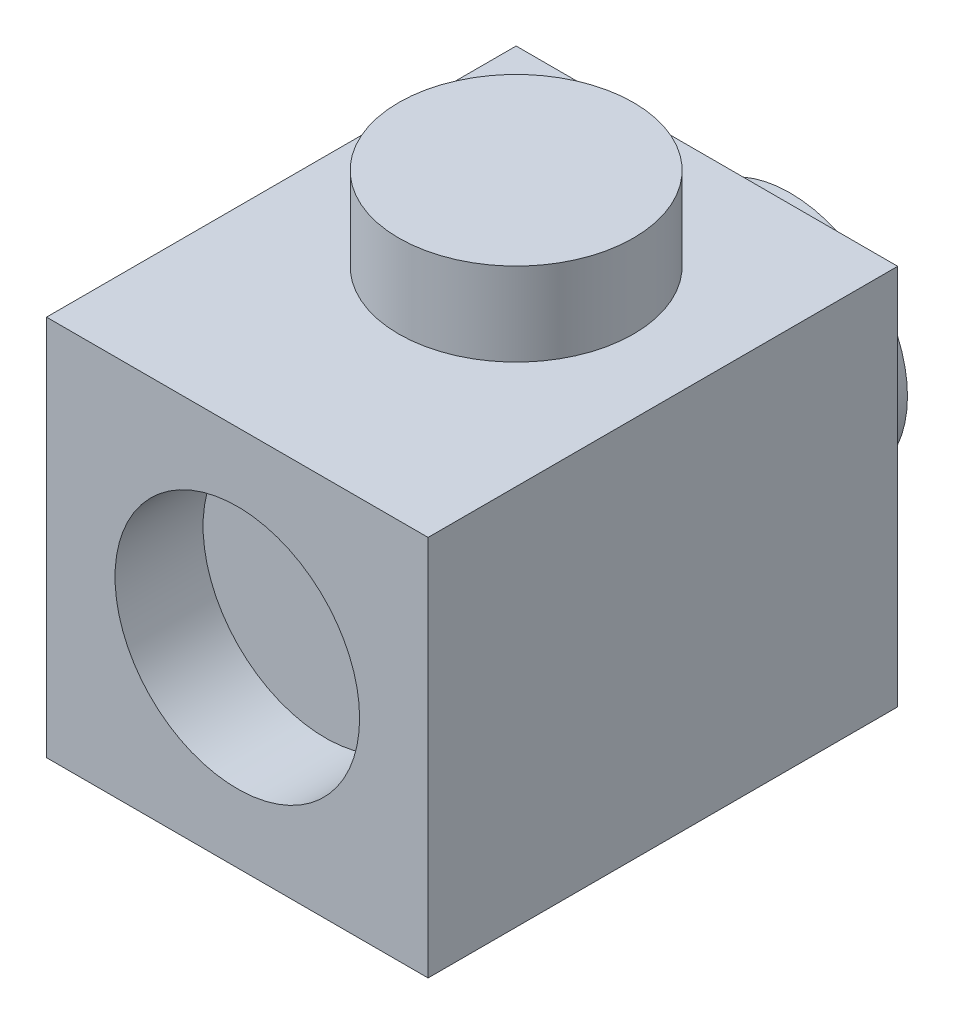
ISO-10303-21;
HEADER;
FILE_DESCRIPTION(('STEP AP214'),'2;1');
FILE_NAME('part.step','',(''),(''),'','','');
FILE_SCHEMA(('AUTOMOTIVE_DESIGN { 1 0 10303 214 1 1 1 1 }'));
ENDSEC;
DATA;
#1=APPLICATION_CONTEXT('core data for automotive mechanical design processes');
#2=APPLICATION_PROTOCOL_DEFINITION('international standard','automotive_design',2000,#1);
#3=PRODUCT_CONTEXT('',#1,'mechanical');
#4=PRODUCT('Part','Part','',(#3));
#5=PRODUCT_RELATED_PRODUCT_CATEGORY('part','',(#4));
#6=PRODUCT_DEFINITION_FORMATION('','',#4);
#7=PRODUCT_DEFINITION_CONTEXT('part definition',#1,'design');
#8=PRODUCT_DEFINITION('design','',#6,#7);
#9=PRODUCT_DEFINITION_SHAPE('','',#8);
#10=(LENGTH_UNIT() NAMED_UNIT(*) SI_UNIT(.MILLI.,.METRE.));
#11=(NAMED_UNIT(*) PLANE_ANGLE_UNIT() SI_UNIT($,.RADIAN.));
#12=(NAMED_UNIT(*) SI_UNIT($,.STERADIAN.) SOLID_ANGLE_UNIT());
#13=UNCERTAINTY_MEASURE_WITH_UNIT(LENGTH_MEASURE(1.E-05),#10,'distance_accuracy_value','');
#14=(GEOMETRIC_REPRESENTATION_CONTEXT(3) GLOBAL_UNCERTAINTY_ASSIGNED_CONTEXT((#13)) GLOBAL_UNIT_ASSIGNED_CONTEXT((#10,
#11,#12)) REPRESENTATION_CONTEXT('',''));
#15=CARTESIAN_POINT('',(0.,0.,0.));
#16=DIRECTION('',(0.,0.,1.));
#17=DIRECTION('',(1.,0.,0.));
#18=AXIS2_PLACEMENT_3D('',#15,#16,#17);
#19=CARTESIAN_POINT('',(0.,0.,0.));
#20=DIRECTION('',(0.,0.,-1.));
#21=DIRECTION('',(-1.,0.,0.));
#22=AXIS2_PLACEMENT_3D('',#19,#20,#21);
#23=PLANE('',#22);
#24=DIRECTION('',(0.,1.,0.));
#25=VECTOR('',#24,1.);
#26=CARTESIAN_POINT('',(3.9,-3.9,0.));
#27=LINE('',#26,#25);
#28=CARTESIAN_POINT('',(3.9,-3.9,0.));
#29=VERTEX_POINT('',#28);
#30=CARTESIAN_POINT('',(3.9,3.9,0.));
#31=VERTEX_POINT('',#30);
#32=EDGE_CURVE('E102',#29,#31,#27,.T.);
#33=ORIENTED_EDGE('',*,*,#32,.F.);
#34=DIRECTION('',(1.,0.,0.));
#35=VECTOR('',#34,1.);
#36=CARTESIAN_POINT('',(-3.9,-3.9,0.));
#37=LINE('',#36,#35);
#38=CARTESIAN_POINT('',(-3.9,-3.9,0.));
#39=VERTEX_POINT('',#38);
#40=EDGE_CURVE('E76',#39,#29,#37,.T.);
#41=ORIENTED_EDGE('',*,*,#40,.F.);
#42=DIRECTION('',(0.,-1.,0.));
#43=VECTOR('',#42,1.);
#44=CARTESIAN_POINT('',(-3.9,-3.9,0.));
#45=LINE('',#44,#43);
#46=CARTESIAN_POINT('',(-3.9,3.9,0.));
#47=VERTEX_POINT('',#46);
#48=EDGE_CURVE('E70',#47,#39,#45,.T.);
#49=ORIENTED_EDGE('',*,*,#48,.F.);
#50=DIRECTION('',(-1.,0.,0.));
#51=VECTOR('',#50,1.);
#52=CARTESIAN_POINT('',(-3.9,3.9,0.));
#53=LINE('',#52,#51);
#54=EDGE_CURVE('E94',#31,#47,#53,.T.);
#55=ORIENTED_EDGE('',*,*,#54,.F.);
#56=EDGE_LOOP('',(#33,#41,#49,#55));
#57=FACE_BOUND('',#56,.T.);
#58=CARTESIAN_POINT('',(0.,0.,0.));
#59=DIRECTION('',(0.,0.,-1.));
#60=DIRECTION('',(-1.,0.,0.));
#61=AXIS2_PLACEMENT_3D('',#58,#59,#60);
#62=CIRCLE('',#61,2.4);
#63=CARTESIAN_POINT('',(-2.4,0.,0.));
#64=VERTEX_POINT('',#63);
#65=EDGE_CURVE('E116',#64,#64,#62,.T.);
#66=ORIENTED_EDGE('',*,*,#65,.F.);
#67=EDGE_LOOP('',(#66));
#68=FACE_BOUND('',#67,.T.);
#69=ADVANCED_FACE('F35',(#57,#68),#23,.T.);
#70=CARTESIAN_POINT('',(3.9,-3.9,9.6));
#71=DIRECTION('',(-1.,0.,0.));
#72=DIRECTION('',(0.,0.,1.));
#73=AXIS2_PLACEMENT_3D('',#70,#71,#72);
#74=PLANE('',#73);
#75=ORIENTED_EDGE('',*,*,#32,.T.);
#76=DIRECTION('',(0.,0.,-1.));
#77=VECTOR('',#76,1.);
#78=CARTESIAN_POINT('',(3.9,3.9,9.6));
#79=LINE('',#78,#77);
#80=CARTESIAN_POINT('',(3.9,3.9,9.6));
#81=VERTEX_POINT('',#80);
#82=EDGE_CURVE('E39',#81,#31,#79,.T.);
#83=ORIENTED_EDGE('',*,*,#82,.F.);
#84=DIRECTION('',(0.,1.,0.));
#85=VECTOR('',#84,1.);
#86=CARTESIAN_POINT('',(3.9,-3.9,9.6));
#87=LINE('',#86,#85);
#88=CARTESIAN_POINT('',(3.9,-3.9,9.6));
#89=VERTEX_POINT('',#88);
#90=EDGE_CURVE('E89',#89,#81,#87,.T.);
#91=ORIENTED_EDGE('',*,*,#90,.F.);
#92=DIRECTION('',(0.,0.,-1.));
#93=VECTOR('',#92,1.);
#94=CARTESIAN_POINT('',(3.9,-3.9,9.6));
#95=LINE('',#94,#93);
#96=EDGE_CURVE('E98',#89,#29,#95,.T.);
#97=ORIENTED_EDGE('',*,*,#96,.T.);
#98=EDGE_LOOP('',(#75,#83,#91,#97));
#99=FACE_BOUND('',#98,.T.);
#100=ADVANCED_FACE('F37',(#99),#74,.F.);
#101=CARTESIAN_POINT('',(-3.9,3.9,9.6));
#102=DIRECTION('',(0.,-1.,0.));
#103=DIRECTION('',(0.,0.,-1.));
#104=AXIS2_PLACEMENT_3D('',#101,#102,#103);
#105=PLANE('',#104);
#106=CARTESIAN_POINT('',(0.,3.9,3.9));
#107=DIRECTION('',(0.,1.,0.));
#108=DIRECTION('',(0.,0.,1.));
#109=AXIS2_PLACEMENT_3D('',#106,#107,#108);
#110=CIRCLE('',#109,2.4);
#111=CARTESIAN_POINT('',(0.,3.9,6.3));
#112=VERTEX_POINT('',#111);
#113=EDGE_CURVE('E11',#112,#112,#110,.T.);
#114=ORIENTED_EDGE('',*,*,#113,.F.);
#115=EDGE_LOOP('',(#114));
#116=FACE_BOUND('',#115,.T.);
#117=ORIENTED_EDGE('',*,*,#54,.T.);
#118=DIRECTION('',(0.,0.,-1.));
#119=VECTOR('',#118,1.);
#120=CARTESIAN_POINT('',(-3.9,3.9,9.6));
#121=LINE('',#120,#119);
#122=CARTESIAN_POINT('',(-3.9,3.9,9.6));
#123=VERTEX_POINT('',#122);
#124=EDGE_CURVE('E92',#123,#47,#121,.T.);
#125=ORIENTED_EDGE('',*,*,#124,.F.);
#126=DIRECTION('',(-1.,0.,0.));
#127=VECTOR('',#126,1.);
#128=CARTESIAN_POINT('',(-3.9,3.9,9.6));
#129=LINE('',#128,#127);
#130=EDGE_CURVE('E84',#81,#123,#129,.T.);
#131=ORIENTED_EDGE('',*,*,#130,.F.);
#132=ORIENTED_EDGE('',*,*,#82,.T.);
#133=EDGE_LOOP('',(#117,#125,#131,#132));
#134=FACE_BOUND('',#133,.T.);
#135=ADVANCED_FACE('F93',(#116,#134),#105,.F.);
#136=CARTESIAN_POINT('',(-3.9,-3.9,9.6));
#137=DIRECTION('',(1.,0.,0.));
#138=DIRECTION('',(0.,0.,-1.));
#139=AXIS2_PLACEMENT_3D('',#136,#137,#138);
#140=PLANE('',#139);
#141=ORIENTED_EDGE('',*,*,#48,.T.);
#142=DIRECTION('',(0.,0.,-1.));
#143=VECTOR('',#142,1.);
#144=CARTESIAN_POINT('',(-3.9,-3.9,9.6));
#145=LINE('',#144,#143);
#146=CARTESIAN_POINT('',(-3.9,-3.9,9.6));
#147=VERTEX_POINT('',#146);
#148=EDGE_CURVE('E95',#147,#39,#145,.T.);
#149=ORIENTED_EDGE('',*,*,#148,.F.);
#150=DIRECTION('',(0.,-1.,0.));
#151=VECTOR('',#150,1.);
#152=CARTESIAN_POINT('',(-3.9,-3.9,9.6));
#153=LINE('',#152,#151);
#154=EDGE_CURVE('E87',#123,#147,#153,.T.);
#155=ORIENTED_EDGE('',*,*,#154,.F.);
#156=ORIENTED_EDGE('',*,*,#124,.T.);
#157=EDGE_LOOP('',(#141,#149,#155,#156));
#158=FACE_BOUND('',#157,.T.);
#159=ADVANCED_FACE('F96',(#158),#140,.F.);
#160=CARTESIAN_POINT('',(-3.9,-3.9,9.6));
#161=DIRECTION('',(0.,1.,0.));
#162=DIRECTION('',(0.,0.,1.));
#163=AXIS2_PLACEMENT_3D('',#160,#161,#162);
#164=PLANE('',#163);
#165=ORIENTED_EDGE('',*,*,#40,.T.);
#166=ORIENTED_EDGE('',*,*,#96,.F.);
#167=DIRECTION('',(1.,0.,0.));
#168=VECTOR('',#167,1.);
#169=CARTESIAN_POINT('',(-3.9,-3.9,9.6));
#170=LINE('',#169,#168);
#171=EDGE_CURVE('E53',#147,#89,#170,.T.);
#172=ORIENTED_EDGE('',*,*,#171,.F.);
#173=ORIENTED_EDGE('',*,*,#148,.T.);
#174=EDGE_LOOP('',(#165,#166,#172,#173));
#175=FACE_BOUND('',#174,.T.);
#176=ADVANCED_FACE('F110',(#175),#164,.F.);
#177=CARTESIAN_POINT('',(0.,0.,9.6));
#178=DIRECTION('',(0.,0.,-1.));
#179=DIRECTION('',(-1.,0.,0.));
#180=AXIS2_PLACEMENT_3D('',#177,#178,#179);
#181=PLANE('',#180);
#182=CARTESIAN_POINT('',(0.,0.,9.6));
#183=DIRECTION('',(0.,0.,1.));
#184=DIRECTION('',(1.,0.,0.));
#185=AXIS2_PLACEMENT_3D('',#182,#183,#184);
#186=CIRCLE('',#185,2.5);
#187=CARTESIAN_POINT('',(2.5,0.,9.6));
#188=VERTEX_POINT('',#187);
#189=EDGE_CURVE('E122',#188,#188,#186,.T.);
#190=ORIENTED_EDGE('',*,*,#189,.F.);
#191=EDGE_LOOP('',(#190));
#192=FACE_BOUND('',#191,.T.);
#193=ORIENTED_EDGE('',*,*,#90,.T.);
#194=ORIENTED_EDGE('',*,*,#130,.T.);
#195=ORIENTED_EDGE('',*,*,#154,.T.);
#196=ORIENTED_EDGE('',*,*,#171,.T.);
#197=EDGE_LOOP('',(#193,#194,#195,#196));
#198=FACE_BOUND('',#197,.T.);
#199=ADVANCED_FACE('F85',(#192,#198),#181,.F.);
#200=CARTESIAN_POINT('',(0.,0.,-1.7));
#201=DIRECTION('',(0.,0.,1.));
#202=DIRECTION('',(1.,0.,0.));
#203=AXIS2_PLACEMENT_3D('',#200,#201,#202);
#204=CYLINDRICAL_SURFACE('',#203,2.4);
#205=CARTESIAN_POINT('',(0.,0.,-1.7));
#206=DIRECTION('',(0.,0.,-1.));
#207=DIRECTION('',(-1.,0.,0.));
#208=AXIS2_PLACEMENT_3D('',#205,#206,#207);
#209=CIRCLE('',#208,2.4);
#210=CARTESIAN_POINT('',(-2.4,0.,-1.7));
#211=VERTEX_POINT('',#210);
#212=EDGE_CURVE('E105',#211,#211,#209,.T.);
#213=ORIENTED_EDGE('',*,*,#212,.F.);
#214=EDGE_LOOP('',(#213));
#215=FACE_BOUND('',#214,.T.);
#216=ORIENTED_EDGE('',*,*,#65,.T.);
#217=EDGE_LOOP('',(#216));
#218=FACE_BOUND('',#217,.T.);
#219=ADVANCED_FACE('F159',(#215,#218),#204,.T.);
#220=CARTESIAN_POINT('',(0.,0.,-1.7));
#221=DIRECTION('',(0.,0.,-1.));
#222=DIRECTION('',(-1.,0.,0.));
#223=AXIS2_PLACEMENT_3D('',#220,#221,#222);
#224=PLANE('',#223);
#225=ORIENTED_EDGE('',*,*,#212,.T.);
#226=EDGE_LOOP('',(#225));
#227=FACE_BOUND('',#226,.T.);
#228=ADVANCED_FACE('F164',(#227),#224,.T.);
#229=CARTESIAN_POINT('',(0.,0.,7.8));
#230=DIRECTION('',(0.,0.,1.));
#231=DIRECTION('',(1.,0.,0.));
#232=AXIS2_PLACEMENT_3D('',#229,#230,#231);
#233=CYLINDRICAL_SURFACE('',#232,2.5);
#234=CARTESIAN_POINT('',(0.,0.,7.8));
#235=DIRECTION('',(0.,0.,1.));
#236=DIRECTION('',(1.,0.,0.));
#237=AXIS2_PLACEMENT_3D('',#234,#235,#236);
#238=CIRCLE('',#237,2.5);
#239=CARTESIAN_POINT('',(2.5,0.,7.8));
#240=VERTEX_POINT('',#239);
#241=EDGE_CURVE('E119',#240,#240,#238,.T.);
#242=ORIENTED_EDGE('',*,*,#241,.F.);
#243=EDGE_LOOP('',(#242));
#244=FACE_BOUND('',#243,.T.);
#245=ORIENTED_EDGE('',*,*,#189,.T.);
#246=EDGE_LOOP('',(#245));
#247=FACE_BOUND('',#246,.T.);
#248=ADVANCED_FACE('F168',(#244,#247),#233,.F.);
#249=CARTESIAN_POINT('',(0.,0.,7.8));
#250=DIRECTION('',(0.,0.,1.));
#251=DIRECTION('',(1.,0.,0.));
#252=AXIS2_PLACEMENT_3D('',#249,#250,#251);
#253=PLANE('',#252);
#254=ORIENTED_EDGE('',*,*,#241,.T.);
#255=EDGE_LOOP('',(#254));
#256=FACE_BOUND('',#255,.T.);
#257=ADVANCED_FACE('F136',(#256),#253,.T.);
#258=CARTESIAN_POINT('',(0.,5.6,3.9));
#259=DIRECTION('',(0.,-1.,0.));
#260=DIRECTION('',(0.,0.,-1.));
#261=AXIS2_PLACEMENT_3D('',#258,#259,#260);
#262=CYLINDRICAL_SURFACE('',#261,2.4);
#263=CARTESIAN_POINT('',(0.,5.6,3.9));
#264=DIRECTION('',(0.,1.,0.));
#265=DIRECTION('',(0.,0.,1.));
#266=AXIS2_PLACEMENT_3D('',#263,#264,#265);
#267=CIRCLE('',#266,2.4);
#268=CARTESIAN_POINT('',(0.,5.6,6.3));
#269=VERTEX_POINT('',#268);
#270=EDGE_CURVE('E125',#269,#269,#267,.T.);
#271=ORIENTED_EDGE('',*,*,#270,.F.);
#272=EDGE_LOOP('',(#271));
#273=FACE_BOUND('',#272,.T.);
#274=ORIENTED_EDGE('',*,*,#113,.T.);
#275=EDGE_LOOP('',(#274));
#276=FACE_BOUND('',#275,.T.);
#277=ADVANCED_FACE('F133',(#273,#276),#262,.T.);
#278=CARTESIAN_POINT('',(0.,5.6,3.9));
#279=DIRECTION('',(0.,1.,0.));
#280=DIRECTION('',(0.,0.,1.));
#281=AXIS2_PLACEMENT_3D('',#278,#279,#280);
#282=PLANE('',#281);
#283=ORIENTED_EDGE('',*,*,#270,.T.);
#284=EDGE_LOOP('',(#283));
#285=FACE_BOUND('',#284,.T.);
#286=ADVANCED_FACE('F131',(#285),#282,.T.);
#287=CLOSED_SHELL('',(#69,#100,#135,#159,#176,#199,#219,#228,#248,#257,#277,#286));
#288=MANIFOLD_SOLID_BREP('B2',#287);
#289=ADVANCED_BREP_SHAPE_REPRESENTATION('',(#18,#288),#14);
#290=SHAPE_DEFINITION_REPRESENTATION(#9,#289);
ENDSEC;
END-ISO-10303-21;
